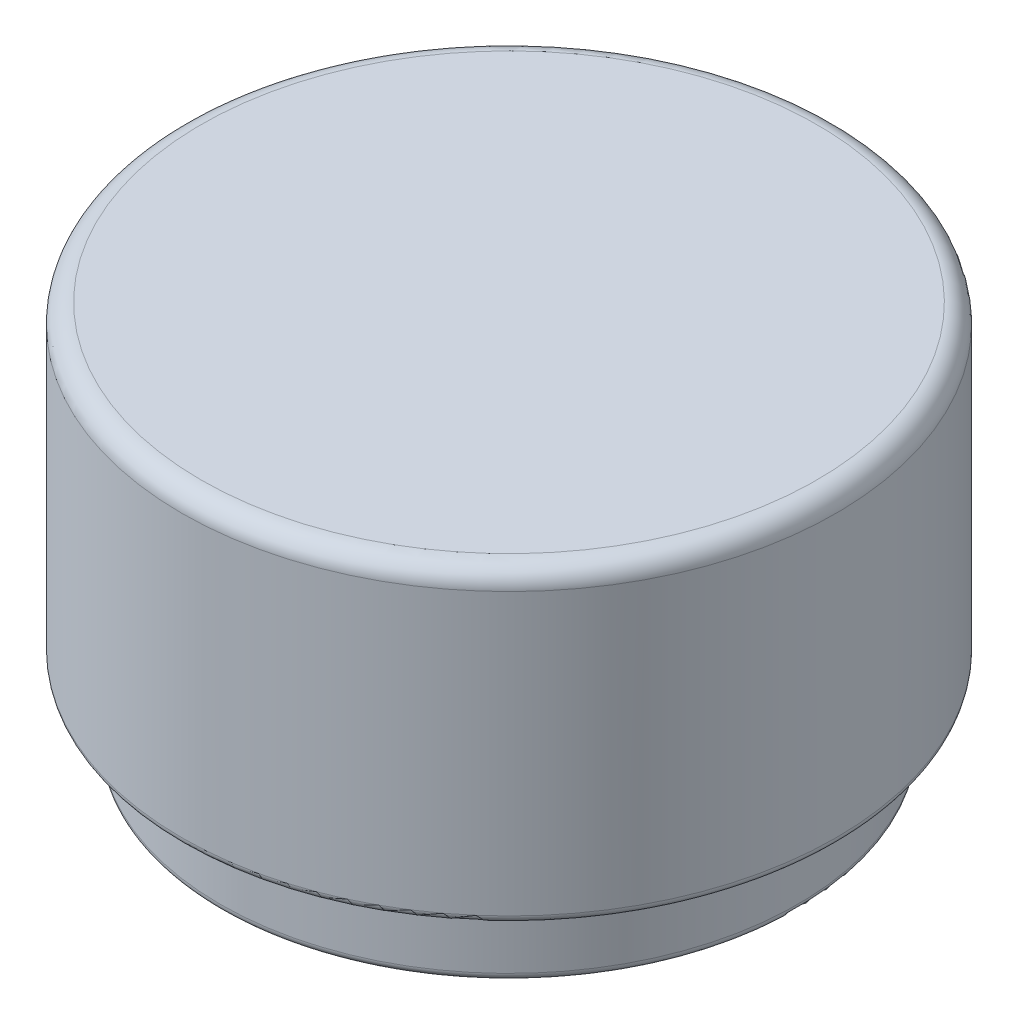
ISO-10303-21;
HEADER;
FILE_DESCRIPTION(('STEP AP214'),'2;1');
FILE_NAME('part.step','',(''),(''),'','','');
FILE_SCHEMA(('AUTOMOTIVE_DESIGN { 1 0 10303 214 1 1 1 1 }'));
ENDSEC;
DATA;
#1=APPLICATION_CONTEXT('core data for automotive mechanical design processes');
#2=APPLICATION_PROTOCOL_DEFINITION('international standard','automotive_design',2000,#1);
#3=PRODUCT_CONTEXT('',#1,'mechanical');
#4=PRODUCT('Part','Part','',(#3));
#5=PRODUCT_RELATED_PRODUCT_CATEGORY('part','',(#4));
#6=PRODUCT_DEFINITION_FORMATION('','',#4);
#7=PRODUCT_DEFINITION_CONTEXT('part definition',#1,'design');
#8=PRODUCT_DEFINITION('design','',#6,#7);
#9=PRODUCT_DEFINITION_SHAPE('','',#8);
#10=(LENGTH_UNIT() NAMED_UNIT(*) SI_UNIT(.MILLI.,.METRE.));
#11=(NAMED_UNIT(*) PLANE_ANGLE_UNIT() SI_UNIT($,.RADIAN.));
#12=(NAMED_UNIT(*) SI_UNIT($,.STERADIAN.) SOLID_ANGLE_UNIT());
#13=UNCERTAINTY_MEASURE_WITH_UNIT(LENGTH_MEASURE(1.E-05),#10,'distance_accuracy_value','');
#14=(GEOMETRIC_REPRESENTATION_CONTEXT(3) GLOBAL_UNCERTAINTY_ASSIGNED_CONTEXT((#13)) GLOBAL_UNIT_ASSIGNED_CONTEXT((#10,
#11,#12)) REPRESENTATION_CONTEXT('',''));
#15=CARTESIAN_POINT('',(0.,0.,0.));
#16=DIRECTION('',(0.,0.,1.));
#17=DIRECTION('',(1.,0.,0.));
#18=AXIS2_PLACEMENT_3D('',#15,#16,#17);
#19=CARTESIAN_POINT('',(0.,-0.5,0.));
#20=DIRECTION('',(0.,-1.,0.));
#21=DIRECTION('',(0.,0.,-1.));
#22=AXIS2_PLACEMENT_3D('',#19,#20,#21);
#23=PLANE('',#22);
#24=CARTESIAN_POINT('',(0.,-0.5,0.));
#25=DIRECTION('',(0.,-1.,0.));
#26=DIRECTION('',(0.,0.,-1.));
#27=AXIS2_PLACEMENT_3D('',#24,#25,#26);
#28=CIRCLE('',#27,7.8);
#29=CARTESIAN_POINT('',(0.,-0.499999999999999,-7.8));
#30=VERTEX_POINT('',#29);
#31=EDGE_CURVE('E63',#30,#30,#28,.T.);
#32=ORIENTED_EDGE('',*,*,#31,.T.);
#33=EDGE_LOOP('',(#32));
#34=FACE_BOUND('',#33,.T.);
#35=ADVANCED_FACE('F31',(#34),#23,.T.);
#36=CARTESIAN_POINT('',(0.,0.,0.));
#37=DIRECTION('',(0.,1.,0.));
#38=DIRECTION('',(0.,0.,1.));
#39=AXIS2_PLACEMENT_3D('',#36,#37,#38);
#40=CYLINDRICAL_SURFACE('',#39,8.);
#41=CARTESIAN_POINT('',(0.,-0.7,0.));
#42=DIRECTION('',(0.,-1.,0.));
#43=DIRECTION('',(0.,0.,-1.));
#44=AXIS2_PLACEMENT_3D('',#41,#42,#43);
#45=CIRCLE('',#44,8.);
#46=CARTESIAN_POINT('',(0.,-0.699999999999999,-8.));
#47=VERTEX_POINT('',#46);
#48=EDGE_CURVE('E66',#47,#47,#45,.F.);
#49=ORIENTED_EDGE('',*,*,#48,.T.);
#50=EDGE_LOOP('',(#49));
#51=FACE_BOUND('',#50,.T.);
#52=CARTESIAN_POINT('',(0.,-7.5,0.));
#53=DIRECTION('',(0.,1.,0.));
#54=DIRECTION('',(0.,0.,1.));
#55=AXIS2_PLACEMENT_3D('',#52,#53,#54);
#56=CIRCLE('',#55,8.);
#57=CARTESIAN_POINT('',(0.,-7.5,8.));
#58=VERTEX_POINT('',#57);
#59=EDGE_CURVE('E75',#58,#58,#56,.T.);
#60=ORIENTED_EDGE('',*,*,#59,.F.);
#61=EDGE_LOOP('',(#60));
#62=FACE_BOUND('',#61,.T.);
#63=ADVANCED_FACE('F99',(#51,#62),#40,.F.);
#64=CARTESIAN_POINT('',(0.,-7.5,7.));
#65=DIRECTION('',(0.,1.,0.));
#66=DIRECTION('',(0.,0.,1.));
#67=AXIS2_PLACEMENT_3D('',#64,#65,#66);
#68=PLANE('',#67);
#69=CARTESIAN_POINT('',(0.,-7.5,0.));
#70=DIRECTION('',(0.,1.,0.));
#71=DIRECTION('',(0.,0.,1.));
#72=AXIS2_PLACEMENT_3D('',#69,#70,#71);
#73=CIRCLE('',#72,7.2);
#74=CARTESIAN_POINT('',(0.,-7.5,7.2));
#75=VERTEX_POINT('',#74);
#76=EDGE_CURVE('E54',#75,#75,#73,.F.);
#77=ORIENTED_EDGE('',*,*,#76,.T.);
#78=EDGE_LOOP('',(#77));
#79=FACE_BOUND('',#78,.T.);
#80=ORIENTED_EDGE('',*,*,#59,.T.);
#81=EDGE_LOOP('',(#80));
#82=FACE_BOUND('',#81,.T.);
#83=ADVANCED_FACE('F105',(#79,#82),#68,.T.);
#84=CARTESIAN_POINT('',(0.,0.,0.));
#85=DIRECTION('',(0.,1.,0.));
#86=DIRECTION('',(0.,0.,1.));
#87=AXIS2_PLACEMENT_3D('',#84,#85,#86);
#88=CYLINDRICAL_SURFACE('',#87,7.);
#89=CARTESIAN_POINT('',(0.,-7.7,0.));
#90=DIRECTION('',(0.,1.,0.));
#91=DIRECTION('',(0.,0.,1.));
#92=AXIS2_PLACEMENT_3D('',#89,#90,#91);
#93=CIRCLE('',#92,7.);
#94=CARTESIAN_POINT('',(0.,-7.7,7.));
#95=VERTEX_POINT('',#94);
#96=EDGE_CURVE('E57',#95,#95,#93,.T.);
#97=ORIENTED_EDGE('',*,*,#96,.T.);
#98=EDGE_LOOP('',(#97));
#99=FACE_BOUND('',#98,.T.);
#100=CARTESIAN_POINT('',(0.,-9.8,0.));
#101=DIRECTION('',(0.,-1.,0.));
#102=DIRECTION('',(0.,0.,-1.));
#103=AXIS2_PLACEMENT_3D('',#100,#101,#102);
#104=CIRCLE('',#103,7.);
#105=CARTESIAN_POINT('',(0.,-9.8,-7.));
#106=VERTEX_POINT('',#105);
#107=EDGE_CURVE('E60',#106,#106,#104,.T.);
#108=ORIENTED_EDGE('',*,*,#107,.T.);
#109=EDGE_LOOP('',(#108));
#110=FACE_BOUND('',#109,.T.);
#111=ADVANCED_FACE('F95',(#99,#110),#88,.F.);
#112=CARTESIAN_POINT('',(0.,-10.,7.));
#113=DIRECTION('',(0.,-1.,0.));
#114=DIRECTION('',(0.,0.,-1.));
#115=AXIS2_PLACEMENT_3D('',#112,#113,#114);
#116=PLANE('',#115);
#117=CARTESIAN_POINT('',(0.,-10.,0.));
#118=DIRECTION('',(0.,-1.,0.));
#119=DIRECTION('',(0.,0.,-1.));
#120=AXIS2_PLACEMENT_3D('',#117,#118,#119);
#121=CIRCLE('',#120,7.2);
#122=CARTESIAN_POINT('',(0.,-10.,-7.2));
#123=VERTEX_POINT('',#122);
#124=EDGE_CURVE('E46',#123,#123,#121,.F.);
#125=ORIENTED_EDGE('',*,*,#124,.T.);
#126=EDGE_LOOP('',(#125));
#127=FACE_BOUND('',#126,.T.);
#128=CARTESIAN_POINT('',(0.,-10.,0.));
#129=DIRECTION('',(0.,-1.,0.));
#130=DIRECTION('',(0.,0.,-1.));
#131=AXIS2_PLACEMENT_3D('',#128,#129,#130);
#132=CIRCLE('',#131,7.3);
#133=CARTESIAN_POINT('',(0.,-10.,-7.3));
#134=VERTEX_POINT('',#133);
#135=EDGE_CURVE('E51',#134,#134,#132,.T.);
#136=ORIENTED_EDGE('',*,*,#135,.T.);
#137=EDGE_LOOP('',(#136));
#138=FACE_BOUND('',#137,.T.);
#139=ADVANCED_FACE('F86',(#127,#138),#116,.T.);
#140=CARTESIAN_POINT('',(0.,0.,0.));
#141=DIRECTION('',(0.,1.,0.));
#142=DIRECTION('',(0.,0.,1.));
#143=AXIS2_PLACEMENT_3D('',#140,#141,#142);
#144=CYLINDRICAL_SURFACE('',#143,7.5);
#145=CARTESIAN_POINT('',(0.,-9.8,0.));
#146=DIRECTION('',(0.,-1.,0.));
#147=DIRECTION('',(0.,0.,-1.));
#148=AXIS2_PLACEMENT_3D('',#145,#146,#147);
#149=CIRCLE('',#148,7.5);
#150=CARTESIAN_POINT('',(0.,-9.8,-7.5));
#151=VERTEX_POINT('',#150);
#152=EDGE_CURVE('E42',#151,#151,#149,.F.);
#153=ORIENTED_EDGE('',*,*,#152,.T.);
#154=EDGE_LOOP('',(#153));
#155=FACE_BOUND('',#154,.T.);
#156=CARTESIAN_POINT('',(0.,-8.,0.));
#157=DIRECTION('',(0.,1.,0.));
#158=DIRECTION('',(0.,0.,1.));
#159=AXIS2_PLACEMENT_3D('',#156,#157,#158);
#160=CIRCLE('',#159,7.5);
#161=CARTESIAN_POINT('',(0.,-8.,7.5));
#162=VERTEX_POINT('',#161);
#163=EDGE_CURVE('E78',#162,#162,#160,.T.);
#164=ORIENTED_EDGE('',*,*,#163,.F.);
#165=EDGE_LOOP('',(#164));
#166=FACE_BOUND('',#165,.T.);
#167=ADVANCED_FACE('F84',(#155,#166),#144,.T.);
#168=CARTESIAN_POINT('',(0.,-8.,7.5));
#169=DIRECTION('',(0.,-1.,0.));
#170=DIRECTION('',(0.,0.,-1.));
#171=AXIS2_PLACEMENT_3D('',#168,#169,#170);
#172=PLANE('',#171);
#173=CARTESIAN_POINT('',(0.,-8.,0.));
#174=DIRECTION('',(0.,-1.,0.));
#175=DIRECTION('',(0.,0.,-1.));
#176=AXIS2_PLACEMENT_3D('',#173,#174,#175);
#177=CIRCLE('',#176,8.3);
#178=CARTESIAN_POINT('',(0.,-8.,-8.3));
#179=VERTEX_POINT('',#178);
#180=EDGE_CURVE('E10',#179,#179,#177,.T.);
#181=ORIENTED_EDGE('',*,*,#180,.T.);
#182=EDGE_LOOP('',(#181));
#183=FACE_BOUND('',#182,.T.);
#184=ORIENTED_EDGE('',*,*,#163,.T.);
#185=EDGE_LOOP('',(#184));
#186=FACE_BOUND('',#185,.T.);
#187=ADVANCED_FACE('F82',(#183,#186),#172,.T.);
#188=CARTESIAN_POINT('',(0.,0.,0.));
#189=DIRECTION('',(0.,1.,0.));
#190=DIRECTION('',(0.,0.,1.));
#191=AXIS2_PLACEMENT_3D('',#188,#189,#190);
#192=CYLINDRICAL_SURFACE('',#191,8.5);
#193=CARTESIAN_POINT('',(0.,-7.8,0.));
#194=DIRECTION('',(0.,-1.,0.));
#195=DIRECTION('',(0.,0.,-1.));
#196=AXIS2_PLACEMENT_3D('',#193,#194,#195);
#197=CIRCLE('',#196,8.5);
#198=CARTESIAN_POINT('',(0.,-7.8,-8.5));
#199=VERTEX_POINT('',#198);
#200=EDGE_CURVE('E38',#199,#199,#197,.F.);
#201=ORIENTED_EDGE('',*,*,#200,.T.);
#202=EDGE_LOOP('',(#201));
#203=FACE_BOUND('',#202,.T.);
#204=CARTESIAN_POINT('',(0.,-0.5,0.));
#205=DIRECTION('',(0.,1.,0.));
#206=DIRECTION('',(0.,0.,1.));
#207=AXIS2_PLACEMENT_3D('',#204,#205,#206);
#208=CIRCLE('',#207,8.5);
#209=CARTESIAN_POINT('',(0.,-0.500000000000001,8.5));
#210=VERTEX_POINT('',#209);
#211=EDGE_CURVE('E69',#210,#210,#208,.F.);
#212=ORIENTED_EDGE('',*,*,#211,.T.);
#213=EDGE_LOOP('',(#212));
#214=FACE_BOUND('',#213,.T.);
#215=ADVANCED_FACE('F93',(#203,#214),#192,.T.);
#216=CARTESIAN_POINT('',(0.,0.,0.));
#217=DIRECTION('',(0.,1.,0.));
#218=DIRECTION('',(0.,0.,1.));
#219=AXIS2_PLACEMENT_3D('',#216,#217,#218);
#220=PLANE('',#219);
#221=CARTESIAN_POINT('',(0.,0.,0.));
#222=DIRECTION('',(0.,1.,0.));
#223=DIRECTION('',(0.,0.,1.));
#224=AXIS2_PLACEMENT_3D('',#221,#222,#223);
#225=CIRCLE('',#224,8.);
#226=CARTESIAN_POINT('',(0.,0.,8.));
#227=VERTEX_POINT('',#226);
#228=EDGE_CURVE('E72',#227,#227,#225,.T.);
#229=ORIENTED_EDGE('',*,*,#228,.T.);
#230=EDGE_LOOP('',(#229));
#231=FACE_BOUND('',#230,.T.);
#232=ADVANCED_FACE('F114',(#231),#220,.T.);
#233=CARTESIAN_POINT('',(0.,-0.5,0.));
#234=DIRECTION('',(0.,1.,0.));
#235=DIRECTION('',(0.,0.,1.));
#236=AXIS2_PLACEMENT_3D('',#233,#234,#235);
#237=TOROIDAL_SURFACE('',#236,8.,0.5);
#238=ORIENTED_EDGE('',*,*,#211,.F.);
#239=EDGE_LOOP('',(#238));
#240=FACE_BOUND('',#239,.T.);
#241=ORIENTED_EDGE('',*,*,#228,.F.);
#242=EDGE_LOOP('',(#241));
#243=FACE_BOUND('',#242,.T.);
#244=ADVANCED_FACE('F110',(#240,#243),#237,.T.);
#245=CARTESIAN_POINT('',(0.,-0.7,0.));
#246=DIRECTION('',(0.,-1.,0.));
#247=DIRECTION('',(0.,0.,-1.));
#248=AXIS2_PLACEMENT_3D('',#245,#246,#247);
#249=TOROIDAL_SURFACE('',#248,7.8,0.2);
#250=ORIENTED_EDGE('',*,*,#31,.F.);
#251=EDGE_LOOP('',(#250));
#252=FACE_BOUND('',#251,.T.);
#253=ORIENTED_EDGE('',*,*,#48,.F.);
#254=EDGE_LOOP('',(#253));
#255=FACE_BOUND('',#254,.T.);
#256=ADVANCED_FACE('F113',(#252,#255),#249,.F.);
#257=CARTESIAN_POINT('',(0.,-7.7,0.));
#258=DIRECTION('',(0.,1.,0.));
#259=DIRECTION('',(0.,0.,1.));
#260=AXIS2_PLACEMENT_3D('',#257,#258,#259);
#261=TOROIDAL_SURFACE('',#260,7.2,0.2);
#262=ORIENTED_EDGE('',*,*,#76,.F.);
#263=EDGE_LOOP('',(#262));
#264=FACE_BOUND('',#263,.T.);
#265=ORIENTED_EDGE('',*,*,#96,.F.);
#266=EDGE_LOOP('',(#265));
#267=FACE_BOUND('',#266,.T.);
#268=ADVANCED_FACE('F118',(#264,#267),#261,.T.);
#269=CARTESIAN_POINT('',(0.,-9.8,0.));
#270=DIRECTION('',(0.,-1.,0.));
#271=DIRECTION('',(0.,0.,-1.));
#272=AXIS2_PLACEMENT_3D('',#269,#270,#271);
#273=TOROIDAL_SURFACE('',#272,7.2,0.2);
#274=ORIENTED_EDGE('',*,*,#107,.F.);
#275=EDGE_LOOP('',(#274));
#276=FACE_BOUND('',#275,.T.);
#277=ORIENTED_EDGE('',*,*,#124,.F.);
#278=EDGE_LOOP('',(#277));
#279=FACE_BOUND('',#278,.T.);
#280=ADVANCED_FACE('F122',(#276,#279),#273,.T.);
#281=CARTESIAN_POINT('',(0.,-9.8,0.));
#282=DIRECTION('',(0.,-1.,0.));
#283=DIRECTION('',(0.,0.,-1.));
#284=AXIS2_PLACEMENT_3D('',#281,#282,#283);
#285=TOROIDAL_SURFACE('',#284,7.3,0.2);
#286=ORIENTED_EDGE('',*,*,#135,.F.);
#287=EDGE_LOOP('',(#286));
#288=FACE_BOUND('',#287,.T.);
#289=ORIENTED_EDGE('',*,*,#152,.F.);
#290=EDGE_LOOP('',(#289));
#291=FACE_BOUND('',#290,.T.);
#292=ADVANCED_FACE('F125',(#288,#291),#285,.T.);
#293=CARTESIAN_POINT('',(0.,-7.8,0.));
#294=DIRECTION('',(0.,-1.,0.));
#295=DIRECTION('',(0.,0.,-1.));
#296=AXIS2_PLACEMENT_3D('',#293,#294,#295);
#297=TOROIDAL_SURFACE('',#296,8.3,0.2);
#298=ORIENTED_EDGE('',*,*,#180,.F.);
#299=EDGE_LOOP('',(#298));
#300=FACE_BOUND('',#299,.T.);
#301=ORIENTED_EDGE('',*,*,#200,.F.);
#302=EDGE_LOOP('',(#301));
#303=FACE_BOUND('',#302,.T.);
#304=ADVANCED_FACE('F33',(#300,#303),#297,.T.);
#305=CLOSED_SHELL('',(#35,#63,#83,#111,#139,#167,#187,#215,#232,#244,#256,#268,#280,#292,#304));
#306=MANIFOLD_SOLID_BREP('B2',#305);
#307=ADVANCED_BREP_SHAPE_REPRESENTATION('',(#18,#306),#14);
#308=SHAPE_DEFINITION_REPRESENTATION(#9,#307);
ENDSEC;
END-ISO-10303-21;
